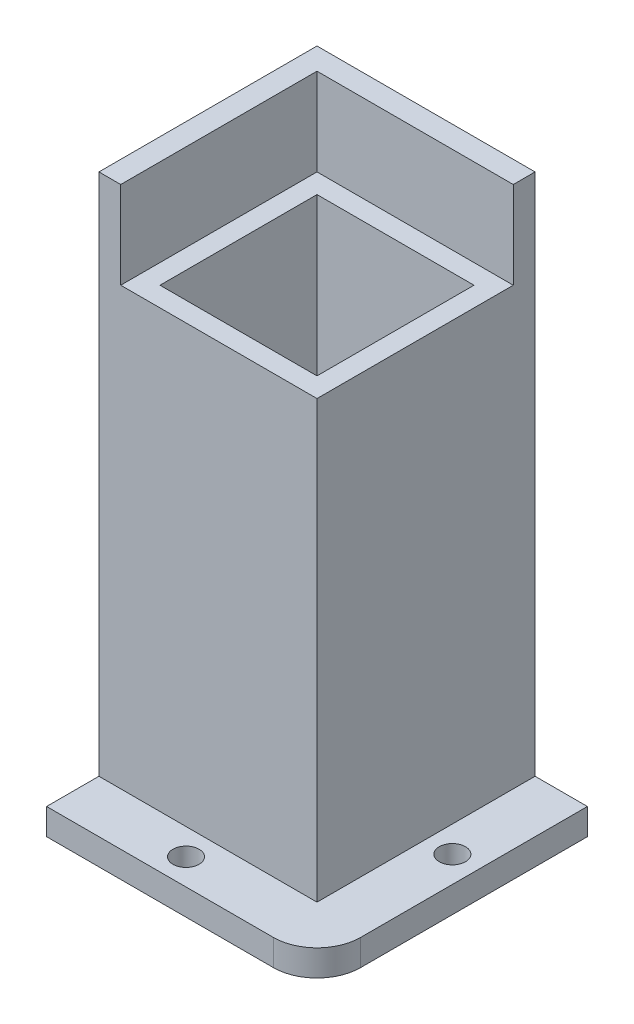
ISO-10303-21;
HEADER;
FILE_DESCRIPTION(('STEP AP214'),'2;1');
FILE_NAME('part.step','',(''),(''),'','','');
FILE_SCHEMA(('AUTOMOTIVE_DESIGN { 1 0 10303 214 1 1 1 1 }'));
ENDSEC;
DATA;
#1=APPLICATION_CONTEXT('core data for automotive mechanical design processes');
#2=APPLICATION_PROTOCOL_DEFINITION('international standard','automotive_design',2000,#1);
#3=PRODUCT_CONTEXT('',#1,'mechanical');
#4=PRODUCT('Part','Part','',(#3));
#5=PRODUCT_RELATED_PRODUCT_CATEGORY('part','',(#4));
#6=PRODUCT_DEFINITION_FORMATION('','',#4);
#7=PRODUCT_DEFINITION_CONTEXT('part definition',#1,'design');
#8=PRODUCT_DEFINITION('design','',#6,#7);
#9=PRODUCT_DEFINITION_SHAPE('','',#8);
#10=(LENGTH_UNIT() NAMED_UNIT(*) SI_UNIT(.MILLI.,.METRE.));
#11=(NAMED_UNIT(*) PLANE_ANGLE_UNIT() SI_UNIT($,.RADIAN.));
#12=(NAMED_UNIT(*) SI_UNIT($,.STERADIAN.) SOLID_ANGLE_UNIT());
#13=UNCERTAINTY_MEASURE_WITH_UNIT(LENGTH_MEASURE(1.E-05),#10,'distance_accuracy_value','');
#14=(GEOMETRIC_REPRESENTATION_CONTEXT(3) GLOBAL_UNCERTAINTY_ASSIGNED_CONTEXT((#13)) GLOBAL_UNIT_ASSIGNED_CONTEXT((#10,
#11,#12)) REPRESENTATION_CONTEXT('',''));
#15=CARTESIAN_POINT('',(0.,0.,0.));
#16=DIRECTION('',(0.,0.,1.));
#17=DIRECTION('',(1.,0.,0.));
#18=AXIS2_PLACEMENT_3D('',#15,#16,#17);
#19=CARTESIAN_POINT('',(12.5,63.,-12.5));
#20=DIRECTION('',(-1.,0.,0.));
#21=DIRECTION('',(0.,0.,1.));
#22=AXIS2_PLACEMENT_3D('',#19,#20,#21);
#23=PLANE('',#22);
#24=DIRECTION('',(0.,0.,1.));
#25=VECTOR('',#24,1.);
#26=CARTESIAN_POINT('',(12.5,3.,0.));
#27=LINE('',#26,#25);
#28=CARTESIAN_POINT('',(12.5,3.,-12.5));
#29=VERTEX_POINT('',#28);
#30=CARTESIAN_POINT('',(12.5,3.,12.5));
#31=VERTEX_POINT('',#30);
#32=EDGE_CURVE('E64',#29,#31,#27,.T.);
#33=ORIENTED_EDGE('',*,*,#32,.F.);
#34=DIRECTION('',(0.,-1.,0.));
#35=VECTOR('',#34,1.);
#36=CARTESIAN_POINT('',(12.5,63.,-12.5));
#37=LINE('',#36,#35);
#38=CARTESIAN_POINT('',(12.5,63.,-12.5));
#39=VERTEX_POINT('',#38);
#40=EDGE_CURVE('E11',#39,#29,#37,.T.);
#41=ORIENTED_EDGE('',*,*,#40,.F.);
#42=DIRECTION('',(0.,0.,-1.));
#43=VECTOR('',#42,1.);
#44=CARTESIAN_POINT('',(12.5,63.,-12.5));
#45=LINE('',#44,#43);
#46=CARTESIAN_POINT('',(12.5,63.,-9.99999999999998));
#47=VERTEX_POINT('',#46);
#48=EDGE_CURVE('E297',#47,#39,#45,.T.);
#49=ORIENTED_EDGE('',*,*,#48,.F.);
#50=DIRECTION('',(0.,1.,0.));
#51=VECTOR('',#50,1.);
#52=CARTESIAN_POINT('',(12.5,53.,-9.99999999999998));
#53=LINE('',#52,#51);
#54=CARTESIAN_POINT('',(12.5,53.,-9.99999999999998));
#55=VERTEX_POINT('',#54);
#56=EDGE_CURVE('E281',#55,#47,#53,.T.);
#57=ORIENTED_EDGE('',*,*,#56,.F.);
#58=DIRECTION('',(0.,0.,-1.));
#59=VECTOR('',#58,1.);
#60=CARTESIAN_POINT('',(12.5,53.,12.5));
#61=LINE('',#60,#59);
#62=CARTESIAN_POINT('',(12.5,53.,12.5));
#63=VERTEX_POINT('',#62);
#64=EDGE_CURVE('E265',#63,#55,#61,.T.);
#65=ORIENTED_EDGE('',*,*,#64,.F.);
#66=DIRECTION('',(0.,-1.,0.));
#67=VECTOR('',#66,1.);
#68=CARTESIAN_POINT('',(12.5,63.,12.5));
#69=LINE('',#68,#67);
#70=EDGE_CURVE('E311',#63,#31,#69,.T.);
#71=ORIENTED_EDGE('',*,*,#70,.T.);
#72=EDGE_LOOP('',(#33,#41,#49,#57,#65,#71));
#73=FACE_BOUND('',#72,.T.);
#74=ADVANCED_FACE('F41',(#73),#23,.F.);
#75=CARTESIAN_POINT('',(-12.5,63.,12.5));
#76=DIRECTION('',(0.,0.,-1.));
#77=DIRECTION('',(-1.,0.,0.));
#78=AXIS2_PLACEMENT_3D('',#75,#76,#77);
#79=PLANE('',#78);
#80=DIRECTION('',(-1.,0.,0.));
#81=VECTOR('',#80,1.);
#82=CARTESIAN_POINT('',(0.,3.,12.5));
#83=LINE('',#82,#81);
#84=CARTESIAN_POINT('',(-12.5,3.,12.5));
#85=VERTEX_POINT('',#84);
#86=EDGE_CURVE('E218',#31,#85,#83,.T.);
#87=ORIENTED_EDGE('',*,*,#86,.F.);
#88=ORIENTED_EDGE('',*,*,#70,.F.);
#89=DIRECTION('',(1.,0.,0.));
#90=VECTOR('',#89,1.);
#91=CARTESIAN_POINT('',(12.5,53.,12.5));
#92=LINE('',#91,#90);
#93=CARTESIAN_POINT('',(-9.99999999999998,53.,12.5));
#94=VERTEX_POINT('',#93);
#95=EDGE_CURVE('E278',#94,#63,#92,.T.);
#96=ORIENTED_EDGE('',*,*,#95,.F.);
#97=DIRECTION('',(0.,1.,0.));
#98=VECTOR('',#97,1.);
#99=CARTESIAN_POINT('',(-9.99999999999998,53.,12.5));
#100=LINE('',#99,#98);
#101=CARTESIAN_POINT('',(-9.99999999999998,63.,12.5));
#102=VERTEX_POINT('',#101);
#103=EDGE_CURVE('E287',#94,#102,#100,.T.);
#104=ORIENTED_EDGE('',*,*,#103,.T.);
#105=DIRECTION('',(1.,0.,0.));
#106=VECTOR('',#105,1.);
#107=CARTESIAN_POINT('',(-12.5,63.,12.5));
#108=LINE('',#107,#106);
#109=CARTESIAN_POINT('',(-12.5,63.,12.5));
#110=VERTEX_POINT('',#109);
#111=EDGE_CURVE('E307',#110,#102,#108,.T.);
#112=ORIENTED_EDGE('',*,*,#111,.F.);
#113=DIRECTION('',(0.,-1.,0.));
#114=VECTOR('',#113,1.);
#115=CARTESIAN_POINT('',(-12.5,63.,12.5));
#116=LINE('',#115,#114);
#117=EDGE_CURVE('E318',#110,#85,#116,.T.);
#118=ORIENTED_EDGE('',*,*,#117,.T.);
#119=EDGE_LOOP('',(#87,#88,#96,#104,#112,#118));
#120=FACE_BOUND('',#119,.T.);
#121=ADVANCED_FACE('F351',(#120),#79,.F.);
#122=CARTESIAN_POINT('',(-12.5,63.,-12.5));
#123=DIRECTION('',(0.,0.,1.));
#124=DIRECTION('',(1.,0.,0.));
#125=AXIS2_PLACEMENT_3D('',#122,#123,#124);
#126=PLANE('',#125);
#127=DIRECTION('',(-1.,0.,0.));
#128=VECTOR('',#127,1.);
#129=CARTESIAN_POINT('',(-12.5,0.,-12.5));
#130=LINE('',#129,#128);
#131=CARTESIAN_POINT('',(18.5,0.,-12.5));
#132=VERTEX_POINT('',#131);
#133=CARTESIAN_POINT('',(-12.5,0.,-12.5));
#134=VERTEX_POINT('',#133);
#135=EDGE_CURVE('E291',#132,#134,#130,.T.);
#136=ORIENTED_EDGE('',*,*,#135,.T.);
#137=DIRECTION('',(0.,-1.,0.));
#138=VECTOR('',#137,1.);
#139=CARTESIAN_POINT('',(-12.5,63.,-12.5));
#140=LINE('',#139,#138);
#141=CARTESIAN_POINT('',(-12.5,63.,-12.5));
#142=VERTEX_POINT('',#141);
#143=EDGE_CURVE('E49',#142,#134,#140,.T.);
#144=ORIENTED_EDGE('',*,*,#143,.F.);
#145=DIRECTION('',(-1.,0.,0.));
#146=VECTOR('',#145,1.);
#147=CARTESIAN_POINT('',(-12.5,63.,-12.5));
#148=LINE('',#147,#146);
#149=EDGE_CURVE('E300',#39,#142,#148,.T.);
#150=ORIENTED_EDGE('',*,*,#149,.F.);
#151=ORIENTED_EDGE('',*,*,#40,.T.);
#152=DIRECTION('',(1.,0.,0.));
#153=VECTOR('',#152,1.);
#154=CARTESIAN_POINT('',(0.,3.,-12.5));
#155=LINE('',#154,#153);
#156=CARTESIAN_POINT('',(18.5,3.,-12.5));
#157=VERTEX_POINT('',#156);
#158=EDGE_CURVE('E224',#29,#157,#155,.T.);
#159=ORIENTED_EDGE('',*,*,#158,.T.);
#160=DIRECTION('',(0.,-1.,0.));
#161=VECTOR('',#160,1.);
#162=CARTESIAN_POINT('',(18.5,3.,-12.5));
#163=LINE('',#162,#161);
#164=EDGE_CURVE('E254',#157,#132,#163,.T.);
#165=ORIENTED_EDGE('',*,*,#164,.T.);
#166=EDGE_LOOP('',(#136,#144,#150,#151,#159,#165));
#167=FACE_BOUND('',#166,.T.);
#168=ADVANCED_FACE('F358',(#167),#126,.F.);
#169=CARTESIAN_POINT('',(-12.5,63.,-12.5));
#170=DIRECTION('',(1.,0.,0.));
#171=DIRECTION('',(0.,0.,-1.));
#172=AXIS2_PLACEMENT_3D('',#169,#170,#171);
#173=PLANE('',#172);
#174=DIRECTION('',(0.,0.,1.));
#175=VECTOR('',#174,1.);
#176=CARTESIAN_POINT('',(-12.5,0.,-12.5));
#177=LINE('',#176,#175);
#178=CARTESIAN_POINT('',(-12.5,0.,18.5));
#179=VERTEX_POINT('',#178);
#180=EDGE_CURVE('E301',#134,#179,#177,.T.);
#181=ORIENTED_EDGE('',*,*,#180,.T.);
#182=DIRECTION('',(0.,-1.,0.));
#183=VECTOR('',#182,1.);
#184=CARTESIAN_POINT('',(-12.5,3.,18.5));
#185=LINE('',#184,#183);
#186=CARTESIAN_POINT('',(-12.5,3.,18.5));
#187=VERTEX_POINT('',#186);
#188=EDGE_CURVE('E258',#187,#179,#185,.T.);
#189=ORIENTED_EDGE('',*,*,#188,.F.);
#190=DIRECTION('',(0.,0.,1.));
#191=VECTOR('',#190,1.);
#192=CARTESIAN_POINT('',(-12.5,3.,0.));
#193=LINE('',#192,#191);
#194=EDGE_CURVE('E215',#85,#187,#193,.T.);
#195=ORIENTED_EDGE('',*,*,#194,.F.);
#196=ORIENTED_EDGE('',*,*,#117,.F.);
#197=DIRECTION('',(0.,0.,1.));
#198=VECTOR('',#197,1.);
#199=CARTESIAN_POINT('',(-12.5,63.,-12.5));
#200=LINE('',#199,#198);
#201=EDGE_CURVE('E304',#142,#110,#200,.T.);
#202=ORIENTED_EDGE('',*,*,#201,.F.);
#203=ORIENTED_EDGE('',*,*,#143,.T.);
#204=EDGE_LOOP('',(#181,#189,#195,#196,#202,#203));
#205=FACE_BOUND('',#204,.T.);
#206=ADVANCED_FACE('F326',(#205),#173,.F.);
#207=CARTESIAN_POINT('',(0.,63.,0.));
#208=DIRECTION('',(0.,1.,0.));
#209=DIRECTION('',(0.,0.,1.));
#210=AXIS2_PLACEMENT_3D('',#207,#208,#209);
#211=PLANE('',#210);
#212=DIRECTION('',(0.,0.,1.));
#213=VECTOR('',#212,1.);
#214=CARTESIAN_POINT('',(-9.99999999999998,63.,12.5));
#215=LINE('',#214,#213);
#216=CARTESIAN_POINT('',(-9.99999999999998,63.,-9.99999999999998));
#217=VERTEX_POINT('',#216);
#218=EDGE_CURVE('E270',#217,#102,#215,.T.);
#219=ORIENTED_EDGE('',*,*,#218,.F.);
#220=DIRECTION('',(-1.,0.,0.));
#221=VECTOR('',#220,1.);
#222=CARTESIAN_POINT('',(12.5,63.,-9.99999999999998));
#223=LINE('',#222,#221);
#224=EDGE_CURVE('E253',#47,#217,#223,.T.);
#225=ORIENTED_EDGE('',*,*,#224,.F.);
#226=ORIENTED_EDGE('',*,*,#48,.T.);
#227=ORIENTED_EDGE('',*,*,#149,.T.);
#228=ORIENTED_EDGE('',*,*,#201,.T.);
#229=ORIENTED_EDGE('',*,*,#111,.T.);
#230=EDGE_LOOP('',(#219,#225,#226,#227,#228,#229));
#231=FACE_BOUND('',#230,.T.);
#232=ADVANCED_FACE('F355',(#231),#211,.T.);
#233=CARTESIAN_POINT('',(0.,0.,0.));
#234=DIRECTION('',(0.,1.,0.));
#235=DIRECTION('',(0.,0.,1.));
#236=AXIS2_PLACEMENT_3D('',#233,#234,#235);
#237=PLANE('',#236);
#238=ORIENTED_EDGE('',*,*,#135,.F.);
#239=DIRECTION('',(0.,0.,1.));
#240=VECTOR('',#239,1.);
#241=CARTESIAN_POINT('',(18.5,0.,0.));
#242=LINE('',#241,#240);
#243=CARTESIAN_POINT('',(18.5,0.,13.5));
#244=VERTEX_POINT('',#243);
#245=EDGE_CURVE('E205',#132,#244,#242,.T.);
#246=ORIENTED_EDGE('',*,*,#245,.T.);
#247=CARTESIAN_POINT('',(13.5,0.,13.5));
#248=DIRECTION('',(0.,-1.,0.));
#249=DIRECTION('',(0.,0.,-1.));
#250=AXIS2_PLACEMENT_3D('',#247,#248,#249);
#251=CIRCLE('',#250,5.);
#252=CARTESIAN_POINT('',(13.5,0.,18.5));
#253=VERTEX_POINT('',#252);
#254=EDGE_CURVE('E240',#253,#244,#251,.F.);
#255=ORIENTED_EDGE('',*,*,#254,.F.);
#256=DIRECTION('',(1.,0.,0.));
#257=VECTOR('',#256,1.);
#258=CARTESIAN_POINT('',(0.,0.,18.5));
#259=LINE('',#258,#257);
#260=EDGE_CURVE('E244',#179,#253,#259,.T.);
#261=ORIENTED_EDGE('',*,*,#260,.F.);
#262=ORIENTED_EDGE('',*,*,#180,.F.);
#263=EDGE_LOOP('',(#238,#246,#255,#261,#262));
#264=FACE_BOUND('',#263,.T.);
#265=CARTESIAN_POINT('',(15.5,0.,-0.018933946286325));
#266=DIRECTION('',(0.,-1.,0.));
#267=DIRECTION('',(0.,0.,-1.));
#268=AXIS2_PLACEMENT_3D('',#265,#266,#267);
#269=CIRCLE('',#268,1.5);
#270=CARTESIAN_POINT('',(15.5,0.,-1.51893394628633));
#271=VERTEX_POINT('',#270);
#272=EDGE_CURVE('E194',#271,#271,#269,.T.);
#273=ORIENTED_EDGE('',*,*,#272,.F.);
#274=EDGE_LOOP('',(#273));
#275=FACE_BOUND('',#274,.T.);
#276=CARTESIAN_POINT('',(0.484011040181487,0.,15.5));
#277=DIRECTION('',(0.,-1.,0.));
#278=DIRECTION('',(0.,0.,-1.));
#279=AXIS2_PLACEMENT_3D('',#276,#277,#278);
#280=CIRCLE('',#279,1.5);
#281=CARTESIAN_POINT('',(0.484011040181487,0.,14.));
#282=VERTEX_POINT('',#281);
#283=EDGE_CURVE('E236',#282,#282,#280,.T.);
#284=ORIENTED_EDGE('',*,*,#283,.F.);
#285=EDGE_LOOP('',(#284));
#286=FACE_BOUND('',#285,.T.);
#287=ADVANCED_FACE('F333',(#264,#275,#286),#237,.F.);
#288=CARTESIAN_POINT('',(-9.99999999999998,53.,12.5));
#289=DIRECTION('',(-1.,0.,0.));
#290=DIRECTION('',(0.,0.,1.));
#291=AXIS2_PLACEMENT_3D('',#288,#289,#290);
#292=PLANE('',#291);
#293=ORIENTED_EDGE('',*,*,#218,.T.);
#294=ORIENTED_EDGE('',*,*,#103,.F.);
#295=DIRECTION('',(0.,0.,1.));
#296=VECTOR('',#295,1.);
#297=CARTESIAN_POINT('',(-9.99999999999998,53.,12.5));
#298=LINE('',#297,#296);
#299=CARTESIAN_POINT('',(-9.99999999999998,53.,-9.99999999999998));
#300=VERTEX_POINT('',#299);
#301=EDGE_CURVE('E274',#300,#94,#298,.T.);
#302=ORIENTED_EDGE('',*,*,#301,.F.);
#303=DIRECTION('',(0.,1.,0.));
#304=VECTOR('',#303,1.);
#305=CARTESIAN_POINT('',(-9.99999999999998,53.,-9.99999999999998));
#306=LINE('',#305,#304);
#307=EDGE_CURVE('E292',#300,#217,#306,.T.);
#308=ORIENTED_EDGE('',*,*,#307,.T.);
#309=EDGE_LOOP('',(#293,#294,#302,#308));
#310=FACE_BOUND('',#309,.T.);
#311=ADVANCED_FACE('F401',(#310),#292,.F.);
#312=CARTESIAN_POINT('',(12.5,53.,-9.99999999999998));
#313=DIRECTION('',(0.,0.,-1.));
#314=DIRECTION('',(-1.,0.,0.));
#315=AXIS2_PLACEMENT_3D('',#312,#313,#314);
#316=PLANE('',#315);
#317=ORIENTED_EDGE('',*,*,#224,.T.);
#318=ORIENTED_EDGE('',*,*,#307,.F.);
#319=DIRECTION('',(-1.,0.,0.));
#320=VECTOR('',#319,1.);
#321=CARTESIAN_POINT('',(12.5,53.,-9.99999999999998));
#322=LINE('',#321,#320);
#323=EDGE_CURVE('E269',#55,#300,#322,.T.);
#324=ORIENTED_EDGE('',*,*,#323,.F.);
#325=ORIENTED_EDGE('',*,*,#56,.T.);
#326=EDGE_LOOP('',(#317,#318,#324,#325));
#327=FACE_BOUND('',#326,.T.);
#328=ADVANCED_FACE('F363',(#327),#316,.F.);
#329=CARTESIAN_POINT('',(0.,53.,0.));
#330=DIRECTION('',(0.,1.,0.));
#331=DIRECTION('',(0.,0.,1.));
#332=AXIS2_PLACEMENT_3D('',#329,#330,#331);
#333=PLANE('',#332);
#334=DIRECTION('',(0.,0.,-1.));
#335=VECTOR('',#334,1.);
#336=CARTESIAN_POINT('',(10.25,53.,-7.74999999999998));
#337=LINE('',#336,#335);
#338=CARTESIAN_POINT('',(10.25,53.,10.25));
#339=VERTEX_POINT('',#338);
#340=CARTESIAN_POINT('',(10.25,53.,-7.74999999999998));
#341=VERTEX_POINT('',#340);
#342=EDGE_CURVE('E56',#339,#341,#337,.T.);
#343=ORIENTED_EDGE('',*,*,#342,.F.);
#344=DIRECTION('',(1.,0.,0.));
#345=VECTOR('',#344,1.);
#346=CARTESIAN_POINT('',(-7.74999999999998,53.,10.25));
#347=LINE('',#346,#345);
#348=CARTESIAN_POINT('',(-7.74999999999998,53.,10.25));
#349=VERTEX_POINT('',#348);
#350=EDGE_CURVE('E172',#349,#339,#347,.T.);
#351=ORIENTED_EDGE('',*,*,#350,.F.);
#352=DIRECTION('',(0.,0.,1.));
#353=VECTOR('',#352,1.);
#354=CARTESIAN_POINT('',(-7.74999999999998,53.,-7.74999999999998));
#355=LINE('',#354,#353);
#356=CARTESIAN_POINT('',(-7.74999999999998,53.,-7.74999999999998));
#357=VERTEX_POINT('',#356);
#358=EDGE_CURVE('E176',#357,#349,#355,.T.);
#359=ORIENTED_EDGE('',*,*,#358,.F.);
#360=DIRECTION('',(-1.,0.,0.));
#361=VECTOR('',#360,1.);
#362=CARTESIAN_POINT('',(-7.74999999999998,53.,-7.74999999999998));
#363=LINE('',#362,#361);
#364=EDGE_CURVE('E185',#341,#357,#363,.T.);
#365=ORIENTED_EDGE('',*,*,#364,.F.);
#366=EDGE_LOOP('',(#343,#351,#359,#365));
#367=FACE_BOUND('',#366,.T.);
#368=ORIENTED_EDGE('',*,*,#64,.T.);
#369=ORIENTED_EDGE('',*,*,#323,.T.);
#370=ORIENTED_EDGE('',*,*,#301,.T.);
#371=ORIENTED_EDGE('',*,*,#95,.T.);
#372=EDGE_LOOP('',(#368,#369,#370,#371));
#373=FACE_BOUND('',#372,.T.);
#374=ADVANCED_FACE('F366',(#367,#373),#333,.T.);
#375=CARTESIAN_POINT('',(13.5,3.,13.5));
#376=DIRECTION('',(0.,-1.,0.));
#377=DIRECTION('',(0.,0.,-1.));
#378=AXIS2_PLACEMENT_3D('',#375,#376,#377);
#379=CYLINDRICAL_SURFACE('',#378,5.);
#380=ORIENTED_EDGE('',*,*,#254,.T.);
#381=DIRECTION('',(0.,-1.,0.));
#382=VECTOR('',#381,1.);
#383=CARTESIAN_POINT('',(18.5,3.,13.5));
#384=LINE('',#383,#382);
#385=CARTESIAN_POINT('',(18.5,3.,13.5));
#386=VERTEX_POINT('',#385);
#387=EDGE_CURVE('E250',#386,#244,#384,.T.);
#388=ORIENTED_EDGE('',*,*,#387,.F.);
#389=CARTESIAN_POINT('',(13.5,3.,13.5));
#390=DIRECTION('',(0.,-1.,0.));
#391=DIRECTION('',(0.,0.,-1.));
#392=AXIS2_PLACEMENT_3D('',#389,#390,#391);
#393=CIRCLE('',#392,5.);
#394=CARTESIAN_POINT('',(13.5,3.,18.5));
#395=VERTEX_POINT('',#394);
#396=EDGE_CURVE('E209',#395,#386,#393,.F.);
#397=ORIENTED_EDGE('',*,*,#396,.F.);
#398=DIRECTION('',(0.,-1.,0.));
#399=VECTOR('',#398,1.);
#400=CARTESIAN_POINT('',(13.5,3.,18.5));
#401=LINE('',#400,#399);
#402=EDGE_CURVE('E232',#395,#253,#401,.T.);
#403=ORIENTED_EDGE('',*,*,#402,.T.);
#404=EDGE_LOOP('',(#380,#388,#397,#403));
#405=FACE_BOUND('',#404,.T.);
#406=ADVANCED_FACE('F342',(#405),#379,.T.);
#407=CARTESIAN_POINT('',(18.5,3.,0.));
#408=DIRECTION('',(1.,0.,0.));
#409=DIRECTION('',(0.,0.,-1.));
#410=AXIS2_PLACEMENT_3D('',#407,#408,#409);
#411=PLANE('',#410);
#412=ORIENTED_EDGE('',*,*,#245,.F.);
#413=ORIENTED_EDGE('',*,*,#164,.F.);
#414=DIRECTION('',(0.,0.,1.));
#415=VECTOR('',#414,1.);
#416=CARTESIAN_POINT('',(18.5,3.,0.));
#417=LINE('',#416,#415);
#418=EDGE_CURVE('E228',#157,#386,#417,.T.);
#419=ORIENTED_EDGE('',*,*,#418,.T.);
#420=ORIENTED_EDGE('',*,*,#387,.T.);
#421=EDGE_LOOP('',(#412,#413,#419,#420));
#422=FACE_BOUND('',#421,.T.);
#423=ADVANCED_FACE('F369',(#422),#411,.T.);
#424=CARTESIAN_POINT('',(0.484011040181487,3.,15.5));
#425=DIRECTION('',(0.,-1.,0.));
#426=DIRECTION('',(0.,0.,-1.));
#427=AXIS2_PLACEMENT_3D('',#424,#425,#426);
#428=CYLINDRICAL_SURFACE('',#427,1.5);
#429=CARTESIAN_POINT('',(0.484011040181487,3.,15.5));
#430=DIRECTION('',(0.,-1.,0.));
#431=DIRECTION('',(0.,0.,-1.));
#432=AXIS2_PLACEMENT_3D('',#429,#430,#431);
#433=CIRCLE('',#432,1.5);
#434=CARTESIAN_POINT('',(0.484011040181487,3.,14.));
#435=VERTEX_POINT('',#434);
#436=EDGE_CURVE('E204',#435,#435,#433,.T.);
#437=ORIENTED_EDGE('',*,*,#436,.F.);
#438=EDGE_LOOP('',(#437));
#439=FACE_BOUND('',#438,.T.);
#440=ORIENTED_EDGE('',*,*,#283,.T.);
#441=EDGE_LOOP('',(#440));
#442=FACE_BOUND('',#441,.T.);
#443=ADVANCED_FACE('F371',(#439,#442),#428,.F.);
#444=CARTESIAN_POINT('',(15.5,3.,-0.018933946286325));
#445=DIRECTION('',(0.,-1.,0.));
#446=DIRECTION('',(0.,0.,-1.));
#447=AXIS2_PLACEMENT_3D('',#444,#445,#446);
#448=CYLINDRICAL_SURFACE('',#447,1.5);
#449=CARTESIAN_POINT('',(15.5,3.,-0.018933946286325));
#450=DIRECTION('',(0.,-1.,0.));
#451=DIRECTION('',(0.,0.,-1.));
#452=AXIS2_PLACEMENT_3D('',#449,#450,#451);
#453=CIRCLE('',#452,1.5);
#454=CARTESIAN_POINT('',(15.5,3.,-1.51893394628633));
#455=VERTEX_POINT('',#454);
#456=EDGE_CURVE('E200',#455,#455,#453,.T.);
#457=ORIENTED_EDGE('',*,*,#456,.F.);
#458=EDGE_LOOP('',(#457));
#459=FACE_BOUND('',#458,.T.);
#460=ORIENTED_EDGE('',*,*,#272,.T.);
#461=EDGE_LOOP('',(#460));
#462=FACE_BOUND('',#461,.T.);
#463=ADVANCED_FACE('F377',(#459,#462),#448,.F.);
#464=CARTESIAN_POINT('',(0.,3.,18.5));
#465=DIRECTION('',(0.,0.,-1.));
#466=DIRECTION('',(-1.,0.,0.));
#467=AXIS2_PLACEMENT_3D('',#464,#465,#466);
#468=PLANE('',#467);
#469=ORIENTED_EDGE('',*,*,#260,.T.);
#470=ORIENTED_EDGE('',*,*,#402,.F.);
#471=DIRECTION('',(1.,0.,0.));
#472=VECTOR('',#471,1.);
#473=CARTESIAN_POINT('',(0.,3.,18.5));
#474=LINE('',#473,#472);
#475=EDGE_CURVE('E212',#187,#395,#474,.T.);
#476=ORIENTED_EDGE('',*,*,#475,.F.);
#477=ORIENTED_EDGE('',*,*,#188,.T.);
#478=EDGE_LOOP('',(#469,#470,#476,#477));
#479=FACE_BOUND('',#478,.T.);
#480=ADVANCED_FACE('F338',(#479),#468,.F.);
#481=CARTESIAN_POINT('',(0.,3.,0.));
#482=DIRECTION('',(0.,-1.,0.));
#483=DIRECTION('',(0.,0.,-1.));
#484=AXIS2_PLACEMENT_3D('',#481,#482,#483);
#485=PLANE('',#484);
#486=ORIENTED_EDGE('',*,*,#456,.T.);
#487=EDGE_LOOP('',(#486));
#488=FACE_BOUND('',#487,.T.);
#489=ORIENTED_EDGE('',*,*,#436,.T.);
#490=EDGE_LOOP('',(#489));
#491=FACE_BOUND('',#490,.T.);
#492=ORIENTED_EDGE('',*,*,#396,.T.);
#493=ORIENTED_EDGE('',*,*,#418,.F.);
#494=ORIENTED_EDGE('',*,*,#158,.F.);
#495=ORIENTED_EDGE('',*,*,#32,.T.);
#496=ORIENTED_EDGE('',*,*,#86,.T.);
#497=ORIENTED_EDGE('',*,*,#194,.T.);
#498=ORIENTED_EDGE('',*,*,#475,.T.);
#499=EDGE_LOOP('',(#492,#493,#494,#495,#496,#497,#498));
#500=FACE_BOUND('',#499,.T.);
#501=ADVANCED_FACE('F346',(#488,#491,#500),#485,.F.);
#502=CARTESIAN_POINT('',(10.25,3.,-7.74999999999998));
#503=DIRECTION('',(1.,0.,0.));
#504=DIRECTION('',(0.,0.,-1.));
#505=AXIS2_PLACEMENT_3D('',#502,#503,#504);
#506=PLANE('',#505);
#507=ORIENTED_EDGE('',*,*,#342,.T.);
#508=DIRECTION('',(0.,1.,0.));
#509=VECTOR('',#508,1.);
#510=CARTESIAN_POINT('',(10.25,3.,-7.74999999999998));
#511=LINE('',#510,#509);
#512=CARTESIAN_POINT('',(10.25,3.,-7.74999999999998));
#513=VERTEX_POINT('',#512);
#514=EDGE_CURVE('E147',#513,#341,#511,.T.);
#515=ORIENTED_EDGE('',*,*,#514,.F.);
#516=DIRECTION('',(0.,0.,-1.));
#517=VECTOR('',#516,1.);
#518=CARTESIAN_POINT('',(10.25,3.,-7.74999999999998));
#519=LINE('',#518,#517);
#520=CARTESIAN_POINT('',(10.25,3.,10.25));
#521=VERTEX_POINT('',#520);
#522=EDGE_CURVE('E151',#521,#513,#519,.T.);
#523=ORIENTED_EDGE('',*,*,#522,.F.);
#524=DIRECTION('',(0.,1.,0.));
#525=VECTOR('',#524,1.);
#526=CARTESIAN_POINT('',(10.25,3.,10.25));
#527=LINE('',#526,#525);
#528=EDGE_CURVE('E191',#521,#339,#527,.T.);
#529=ORIENTED_EDGE('',*,*,#528,.T.);
#530=EDGE_LOOP('',(#507,#515,#523,#529));
#531=FACE_BOUND('',#530,.T.);
#532=ADVANCED_FACE('F149',(#531),#506,.F.);
#533=CARTESIAN_POINT('',(-7.74999999999998,3.,10.25));
#534=DIRECTION('',(0.,0.,1.));
#535=DIRECTION('',(1.,0.,0.));
#536=AXIS2_PLACEMENT_3D('',#533,#534,#535);
#537=PLANE('',#536);
#538=ORIENTED_EDGE('',*,*,#350,.T.);
#539=ORIENTED_EDGE('',*,*,#528,.F.);
#540=DIRECTION('',(1.,0.,0.));
#541=VECTOR('',#540,1.);
#542=CARTESIAN_POINT('',(-7.74999999999998,3.,10.25));
#543=LINE('',#542,#541);
#544=CARTESIAN_POINT('',(-7.74999999999998,3.,10.25));
#545=VERTEX_POINT('',#544);
#546=EDGE_CURVE('E158',#545,#521,#543,.T.);
#547=ORIENTED_EDGE('',*,*,#546,.F.);
#548=DIRECTION('',(0.,1.,0.));
#549=VECTOR('',#548,1.);
#550=CARTESIAN_POINT('',(-7.74999999999998,3.,10.25));
#551=LINE('',#550,#549);
#552=EDGE_CURVE('E195',#545,#349,#551,.T.);
#553=ORIENTED_EDGE('',*,*,#552,.T.);
#554=EDGE_LOOP('',(#538,#539,#547,#553));
#555=FACE_BOUND('',#554,.T.);
#556=ADVANCED_FACE('F421',(#555),#537,.F.);
#557=CARTESIAN_POINT('',(-7.74999999999998,3.,-7.74999999999998));
#558=DIRECTION('',(-1.,0.,0.));
#559=DIRECTION('',(0.,0.,1.));
#560=AXIS2_PLACEMENT_3D('',#557,#558,#559);
#561=PLANE('',#560);
#562=ORIENTED_EDGE('',*,*,#358,.T.);
#563=ORIENTED_EDGE('',*,*,#552,.F.);
#564=DIRECTION('',(0.,0.,1.));
#565=VECTOR('',#564,1.);
#566=CARTESIAN_POINT('',(-7.74999999999998,3.,-7.74999999999998));
#567=LINE('',#566,#565);
#568=CARTESIAN_POINT('',(-7.74999999999998,3.,-7.74999999999998));
#569=VERTEX_POINT('',#568);
#570=EDGE_CURVE('E167',#569,#545,#567,.T.);
#571=ORIENTED_EDGE('',*,*,#570,.F.);
#572=DIRECTION('',(0.,1.,0.));
#573=VECTOR('',#572,1.);
#574=CARTESIAN_POINT('',(-7.74999999999998,3.,-7.74999999999998));
#575=LINE('',#574,#573);
#576=EDGE_CURVE('E157',#569,#357,#575,.T.);
#577=ORIENTED_EDGE('',*,*,#576,.T.);
#578=EDGE_LOOP('',(#562,#563,#571,#577));
#579=FACE_BOUND('',#578,.T.);
#580=ADVANCED_FACE('F427',(#579),#561,.F.);
#581=CARTESIAN_POINT('',(-7.74999999999998,3.,-7.74999999999998));
#582=DIRECTION('',(0.,0.,-1.));
#583=DIRECTION('',(-1.,0.,0.));
#584=AXIS2_PLACEMENT_3D('',#581,#582,#583);
#585=PLANE('',#584);
#586=ORIENTED_EDGE('',*,*,#364,.T.);
#587=ORIENTED_EDGE('',*,*,#576,.F.);
#588=DIRECTION('',(-1.,0.,0.));
#589=VECTOR('',#588,1.);
#590=CARTESIAN_POINT('',(-7.74999999999998,3.,-7.74999999999998));
#591=LINE('',#590,#589);
#592=EDGE_CURVE('E161',#513,#569,#591,.T.);
#593=ORIENTED_EDGE('',*,*,#592,.F.);
#594=ORIENTED_EDGE('',*,*,#514,.T.);
#595=EDGE_LOOP('',(#586,#587,#593,#594));
#596=FACE_BOUND('',#595,.T.);
#597=ADVANCED_FACE('F162',(#596),#585,.F.);
#598=CARTESIAN_POINT('',(0.,3.,0.));
#599=DIRECTION('',(0.,1.,0.));
#600=DIRECTION('',(0.,0.,1.));
#601=AXIS2_PLACEMENT_3D('',#598,#599,#600);
#602=PLANE('',#601);
#603=ORIENTED_EDGE('',*,*,#522,.T.);
#604=ORIENTED_EDGE('',*,*,#592,.T.);
#605=ORIENTED_EDGE('',*,*,#570,.T.);
#606=ORIENTED_EDGE('',*,*,#546,.T.);
#607=EDGE_LOOP('',(#603,#604,#605,#606));
#608=FACE_BOUND('',#607,.T.);
#609=ADVANCED_FACE('F169',(#608),#602,.T.);
#610=CLOSED_SHELL('',(#74,#121,#168,#206,#232,#287,#311,#328,#374,#406,#423,#443,#463,#480,#501,
#532,#556,#580,#597,#609));
#611=MANIFOLD_SOLID_BREP('B2',#610);
#612=ADVANCED_BREP_SHAPE_REPRESENTATION('',(#18,#611),#14);
#613=SHAPE_DEFINITION_REPRESENTATION(#9,#612);
ENDSEC;
END-ISO-10303-21;
